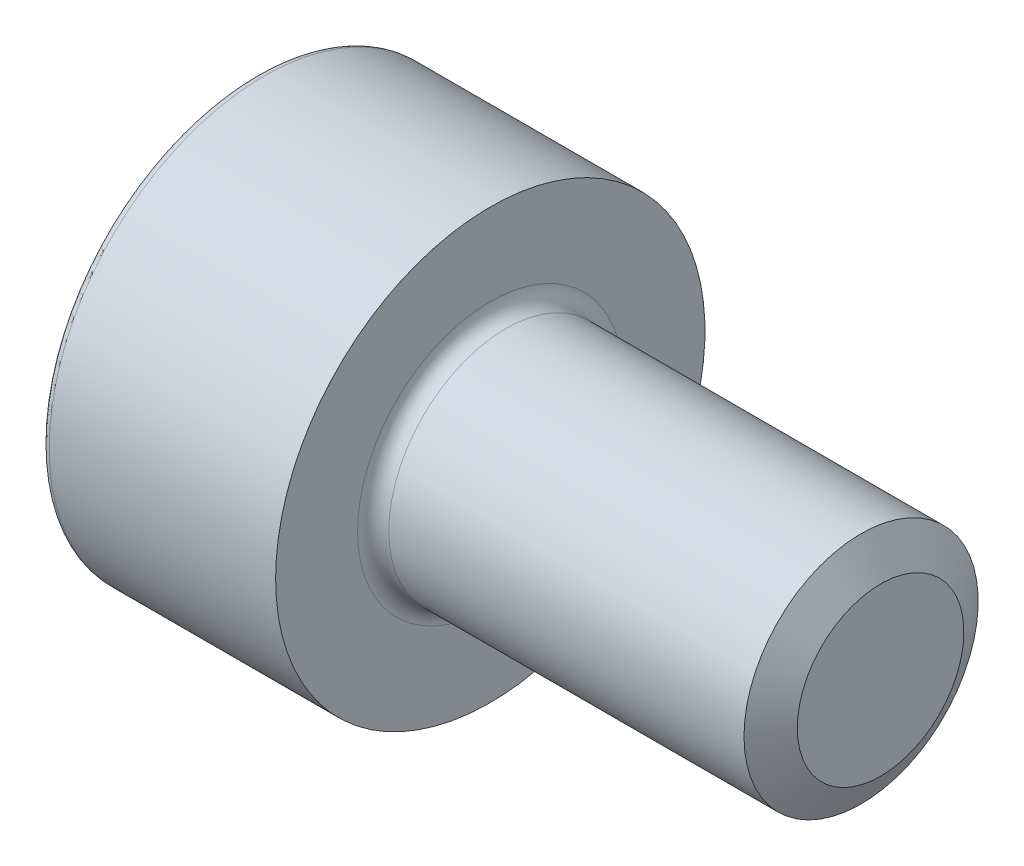
ISO-10303-21;
HEADER;
FILE_DESCRIPTION(('STEP AP214'),'2;1');
FILE_NAME('part.step','',(''),(''),'','','');
FILE_SCHEMA(('AUTOMOTIVE_DESIGN { 1 0 10303 214 1 1 1 1 }'));
ENDSEC;
DATA;
#1=APPLICATION_CONTEXT('core data for automotive mechanical design processes');
#2=APPLICATION_PROTOCOL_DEFINITION('international standard','automotive_design',2000,#1);
#3=PRODUCT_CONTEXT('',#1,'mechanical');
#4=PRODUCT('Part','Part','',(#3));
#5=PRODUCT_RELATED_PRODUCT_CATEGORY('part','',(#4));
#6=PRODUCT_DEFINITION_FORMATION('','',#4);
#7=PRODUCT_DEFINITION_CONTEXT('part definition',#1,'design');
#8=PRODUCT_DEFINITION('design','',#6,#7);
#9=PRODUCT_DEFINITION_SHAPE('','',#8);
#10=(LENGTH_UNIT() NAMED_UNIT(*) SI_UNIT(.MILLI.,.METRE.));
#11=(NAMED_UNIT(*) PLANE_ANGLE_UNIT() SI_UNIT($,.RADIAN.));
#12=(NAMED_UNIT(*) SI_UNIT($,.STERADIAN.) SOLID_ANGLE_UNIT());
#13=UNCERTAINTY_MEASURE_WITH_UNIT(LENGTH_MEASURE(1.E-05),#10,'distance_accuracy_value','');
#14=(GEOMETRIC_REPRESENTATION_CONTEXT(3) GLOBAL_UNCERTAINTY_ASSIGNED_CONTEXT((#13)) GLOBAL_UNIT_ASSIGNED_CONTEXT((#10,
#11,#12)) REPRESENTATION_CONTEXT('',''));
#15=CARTESIAN_POINT('',(0.,0.,0.));
#16=DIRECTION('',(0.,0.,1.));
#17=DIRECTION('',(1.,0.,0.));
#18=AXIS2_PLACEMENT_3D('',#15,#16,#17);
#19=CARTESIAN_POINT('',(0.,0.,0.));
#20=DIRECTION('',(-1.,0.,0.));
#21=DIRECTION('',(0.,0.,1.));
#22=AXIS2_PLACEMENT_3D('',#19,#20,#21);
#23=CYLINDRICAL_SURFACE('',#22,1.5);
#24=CARTESIAN_POINT('',(3.2,0.,0.));
#25=DIRECTION('',(-1.,0.,0.));
#26=DIRECTION('',(0.,0.,1.));
#27=AXIS2_PLACEMENT_3D('',#24,#25,#26);
#28=CIRCLE('',#27,1.5);
#29=CARTESIAN_POINT('',(3.2,0.,1.5));
#30=VERTEX_POINT('',#29);
#31=EDGE_CURVE('E143',#30,#30,#28,.T.);
#32=ORIENTED_EDGE('',*,*,#31,.F.);
#33=EDGE_LOOP('',(#32));
#34=FACE_BOUND('',#33,.T.);
#35=CARTESIAN_POINT('',(7.75000733344089,0.,0.));
#36=DIRECTION('',(-1.,0.,0.));
#37=DIRECTION('',(0.,0.,1.));
#38=AXIS2_PLACEMENT_3D('',#35,#36,#37);
#39=CIRCLE('',#38,1.5);
#40=CARTESIAN_POINT('',(7.75000733344089,0.,1.5));
#41=VERTEX_POINT('',#40);
#42=EDGE_CURVE('E280',#41,#41,#39,.T.);
#43=ORIENTED_EDGE('',*,*,#42,.T.);
#44=EDGE_LOOP('',(#43));
#45=FACE_BOUND('',#44,.T.);
#46=ADVANCED_FACE('F40',(#34,#45),#23,.T.);
#47=CARTESIAN_POINT('',(0.,0.,0.));
#48=DIRECTION('',(1.,0.,0.));
#49=DIRECTION('',(0.,0.,-1.));
#50=AXIS2_PLACEMENT_3D('',#47,#48,#49);
#51=PLANE('',#50);
#52=CARTESIAN_POINT('',(0.,0.,0.));
#53=DIRECTION('',(1.,0.,0.));
#54=DIRECTION('',(0.,0.,-1.));
#55=AXIS2_PLACEMENT_3D('',#52,#53,#54);
#56=CIRCLE('',#55,2.65);
#57=CARTESIAN_POINT('',(0.,0.,-2.65));
#58=VERTEX_POINT('',#57);
#59=EDGE_CURVE('E48',#58,#58,#56,.F.);
#60=ORIENTED_EDGE('',*,*,#59,.T.);
#61=EDGE_LOOP('',(#60));
#62=FACE_BOUND('',#61,.T.);
#63=DIRECTION('',(0.,0.866025403784439,-0.5));
#64=VECTOR('',#63,1.);
#65=CARTESIAN_POINT('',(0.,0.,1.435));
#66=LINE('',#65,#64);
#67=CARTESIAN_POINT('',(0.,0.,1.435));
#68=VERTEX_POINT('',#67);
#69=CARTESIAN_POINT('',(0.,1.24274645443067,0.717499999999999));
#70=VERTEX_POINT('',#69);
#71=EDGE_CURVE('E129',#68,#70,#66,.T.);
#72=ORIENTED_EDGE('',*,*,#71,.F.);
#73=DIRECTION('',(0.,0.866025403784439,0.5));
#74=VECTOR('',#73,1.);
#75=CARTESIAN_POINT('',(0.,-1.24274645443067,0.7175));
#76=LINE('',#75,#74);
#77=CARTESIAN_POINT('',(0.,-1.24274645443067,0.7175));
#78=VERTEX_POINT('',#77);
#79=EDGE_CURVE('E55',#78,#68,#76,.T.);
#80=ORIENTED_EDGE('',*,*,#79,.F.);
#81=DIRECTION('',(0.,0.,1.));
#82=VECTOR('',#81,1.);
#83=CARTESIAN_POINT('',(0.,-1.24274645443067,-0.7175));
#84=LINE('',#83,#82);
#85=CARTESIAN_POINT('',(0.,-1.24274645443067,-0.7175));
#86=VERTEX_POINT('',#85);
#87=EDGE_CURVE('E139',#86,#78,#84,.T.);
#88=ORIENTED_EDGE('',*,*,#87,.F.);
#89=DIRECTION('',(0.,-0.866025403784439,0.5));
#90=VECTOR('',#89,1.);
#91=CARTESIAN_POINT('',(0.,0.,-1.435));
#92=LINE('',#91,#90);
#93=CARTESIAN_POINT('',(0.,0.,-1.435));
#94=VERTEX_POINT('',#93);
#95=EDGE_CURVE('E137',#94,#86,#92,.T.);
#96=ORIENTED_EDGE('',*,*,#95,.F.);
#97=DIRECTION('',(0.,-0.866025403784439,-0.5));
#98=VECTOR('',#97,1.);
#99=CARTESIAN_POINT('',(0.,1.24274645443067,-0.7175));
#100=LINE('',#99,#98);
#101=CARTESIAN_POINT('',(0.,1.24274645443067,-0.7175));
#102=VERTEX_POINT('',#101);
#103=EDGE_CURVE('E103',#102,#94,#100,.T.);
#104=ORIENTED_EDGE('',*,*,#103,.F.);
#105=DIRECTION('',(0.,0.,-1.));
#106=VECTOR('',#105,1.);
#107=CARTESIAN_POINT('',(0.,1.24274645443067,0.717499999999999));
#108=LINE('',#107,#106);
#109=EDGE_CURVE('E133',#70,#102,#108,.T.);
#110=ORIENTED_EDGE('',*,*,#109,.F.);
#111=EDGE_LOOP('',(#72,#80,#88,#96,#104,#110));
#112=FACE_BOUND('',#111,.T.);
#113=ADVANCED_FACE('F160',(#62,#112),#51,.F.);
#114=CARTESIAN_POINT('',(0.,0.,0.));
#115=DIRECTION('',(-1.,0.,0.));
#116=DIRECTION('',(0.,0.,1.));
#117=AXIS2_PLACEMENT_3D('',#114,#115,#116);
#118=CYLINDRICAL_SURFACE('',#117,2.75);
#119=CARTESIAN_POINT('',(0.1,0.,0.));
#120=DIRECTION('',(1.,0.,0.));
#121=DIRECTION('',(0.,0.,-1.));
#122=AXIS2_PLACEMENT_3D('',#119,#120,#121);
#123=CIRCLE('',#122,2.75);
#124=CARTESIAN_POINT('',(0.1,0.,-2.75));
#125=VERTEX_POINT('',#124);
#126=EDGE_CURVE('E11',#125,#125,#123,.T.);
#127=ORIENTED_EDGE('',*,*,#126,.T.);
#128=EDGE_LOOP('',(#127));
#129=FACE_BOUND('',#128,.T.);
#130=CARTESIAN_POINT('',(3.,0.,0.));
#131=DIRECTION('',(-1.,0.,0.));
#132=DIRECTION('',(0.,0.,1.));
#133=AXIS2_PLACEMENT_3D('',#130,#131,#132);
#134=CIRCLE('',#133,2.75);
#135=CARTESIAN_POINT('',(3.,0.,2.75));
#136=VERTEX_POINT('',#135);
#137=EDGE_CURVE('E154',#136,#136,#134,.T.);
#138=ORIENTED_EDGE('',*,*,#137,.T.);
#139=EDGE_LOOP('',(#138));
#140=FACE_BOUND('',#139,.T.);
#141=ADVANCED_FACE('F179',(#129,#140),#118,.T.);
#142=CARTESIAN_POINT('',(3.,2.75,0.));
#143=DIRECTION('',(-1.,0.,0.));
#144=DIRECTION('',(0.,0.,1.));
#145=AXIS2_PLACEMENT_3D('',#142,#143,#144);
#146=PLANE('',#145);
#147=ORIENTED_EDGE('',*,*,#137,.F.);
#148=EDGE_LOOP('',(#147));
#149=FACE_BOUND('',#148,.T.);
#150=CARTESIAN_POINT('',(3.,0.,0.));
#151=DIRECTION('',(-1.,0.,0.));
#152=DIRECTION('',(0.,0.,1.));
#153=AXIS2_PLACEMENT_3D('',#150,#151,#152);
#154=CIRCLE('',#153,1.7);
#155=CARTESIAN_POINT('',(3.,0.,1.7));
#156=VERTEX_POINT('',#155);
#157=EDGE_CURVE('E151',#156,#156,#154,.T.);
#158=ORIENTED_EDGE('',*,*,#157,.T.);
#159=EDGE_LOOP('',(#158));
#160=FACE_BOUND('',#159,.T.);
#161=ADVANCED_FACE('F188',(#149,#160),#146,.F.);
#162=CARTESIAN_POINT('',(3.2,0.,0.));
#163=DIRECTION('',(-1.,0.,0.));
#164=DIRECTION('',(0.,0.,1.));
#165=AXIS2_PLACEMENT_3D('',#162,#163,#164);
#166=TOROIDAL_SURFACE('',#165,1.7,0.2);
#167=ORIENTED_EDGE('',*,*,#157,.F.);
#168=EDGE_LOOP('',(#167));
#169=FACE_BOUND('',#168,.T.);
#170=ORIENTED_EDGE('',*,*,#31,.T.);
#171=EDGE_LOOP('',(#170));
#172=FACE_BOUND('',#171,.T.);
#173=ADVANCED_FACE('F184',(#169,#172),#166,.F.);
#174=CARTESIAN_POINT('',(1.3,-1.24274645443067,0.7175));
#175=DIRECTION('',(0.,-0.5,0.866025403784439));
#176=DIRECTION('',(0.,-0.866025403784439,-0.5));
#177=AXIS2_PLACEMENT_3D('',#174,#175,#176);
#178=PLANE('',#177);
#179=ORIENTED_EDGE('',*,*,#79,.T.);
#180=DIRECTION('',(-1.,0.,0.));
#181=VECTOR('',#180,1.);
#182=CARTESIAN_POINT('',(1.3,0.,1.435));
#183=LINE('',#182,#181);
#184=CARTESIAN_POINT('',(1.3,0.,1.435));
#185=VERTEX_POINT('',#184);
#186=EDGE_CURVE('E85',#185,#68,#183,.T.);
#187=ORIENTED_EDGE('',*,*,#186,.F.);
#188=DIRECTION('',(0.,0.866025403784439,0.5));
#189=VECTOR('',#188,1.);
#190=CARTESIAN_POINT('',(1.3,-1.24274645443067,0.7175));
#191=LINE('',#190,#189);
#192=CARTESIAN_POINT('',(1.3,-1.24274645443067,0.7175));
#193=VERTEX_POINT('',#192);
#194=EDGE_CURVE('E141',#193,#185,#191,.T.);
#195=ORIENTED_EDGE('',*,*,#194,.F.);
#196=DIRECTION('',(-1.,0.,0.));
#197=VECTOR('',#196,1.);
#198=CARTESIAN_POINT('',(1.3,-1.24274645443067,0.7175));
#199=LINE('',#198,#197);
#200=EDGE_CURVE('E63',#193,#78,#199,.T.);
#201=ORIENTED_EDGE('',*,*,#200,.T.);
#202=EDGE_LOOP('',(#179,#187,#195,#201));
#203=FACE_BOUND('',#202,.T.);
#204=ADVANCED_FACE('F187',(#203),#178,.F.);
#205=CARTESIAN_POINT('',(1.3,-1.24274645443067,-0.7175));
#206=DIRECTION('',(0.,-1.,0.));
#207=DIRECTION('',(0.,0.,-1.));
#208=AXIS2_PLACEMENT_3D('',#205,#206,#207);
#209=PLANE('',#208);
#210=ORIENTED_EDGE('',*,*,#87,.T.);
#211=ORIENTED_EDGE('',*,*,#200,.F.);
#212=DIRECTION('',(0.,0.,1.));
#213=VECTOR('',#212,1.);
#214=CARTESIAN_POINT('',(1.3,-1.24274645443067,-0.7175));
#215=LINE('',#214,#213);
#216=CARTESIAN_POINT('',(1.3,-1.24274645443067,-0.7175));
#217=VERTEX_POINT('',#216);
#218=EDGE_CURVE('E115',#217,#193,#215,.T.);
#219=ORIENTED_EDGE('',*,*,#218,.F.);
#220=DIRECTION('',(-1.,0.,0.));
#221=VECTOR('',#220,1.);
#222=CARTESIAN_POINT('',(1.3,-1.24274645443067,-0.7175));
#223=LINE('',#222,#221);
#224=EDGE_CURVE('E107',#217,#86,#223,.T.);
#225=ORIENTED_EDGE('',*,*,#224,.T.);
#226=EDGE_LOOP('',(#210,#211,#219,#225));
#227=FACE_BOUND('',#226,.T.);
#228=ADVANCED_FACE('F218',(#227),#209,.F.);
#229=CARTESIAN_POINT('',(1.3,0.,-1.435));
#230=DIRECTION('',(0.,-0.5,-0.866025403784439));
#231=DIRECTION('',(0.,0.866025403784439,-0.5));
#232=AXIS2_PLACEMENT_3D('',#229,#230,#231);
#233=PLANE('',#232);
#234=ORIENTED_EDGE('',*,*,#95,.T.);
#235=ORIENTED_EDGE('',*,*,#224,.F.);
#236=DIRECTION('',(0.,-0.866025403784439,0.5));
#237=VECTOR('',#236,1.);
#238=CARTESIAN_POINT('',(1.3,0.,-1.435));
#239=LINE('',#238,#237);
#240=CARTESIAN_POINT('',(1.3,0.,-1.435));
#241=VERTEX_POINT('',#240);
#242=EDGE_CURVE('E111',#241,#217,#239,.T.);
#243=ORIENTED_EDGE('',*,*,#242,.F.);
#244=DIRECTION('',(-1.,0.,0.));
#245=VECTOR('',#244,1.);
#246=CARTESIAN_POINT('',(1.3,0.,-1.435));
#247=LINE('',#246,#245);
#248=EDGE_CURVE('E96',#241,#94,#247,.T.);
#249=ORIENTED_EDGE('',*,*,#248,.T.);
#250=EDGE_LOOP('',(#234,#235,#243,#249));
#251=FACE_BOUND('',#250,.T.);
#252=ADVANCED_FACE('F112',(#251),#233,.F.);
#253=CARTESIAN_POINT('',(1.3,1.24274645443067,-0.7175));
#254=DIRECTION('',(0.,0.5,-0.866025403784439));
#255=DIRECTION('',(0.,0.866025403784439,0.5));
#256=AXIS2_PLACEMENT_3D('',#253,#254,#255);
#257=PLANE('',#256);
#258=ORIENTED_EDGE('',*,*,#103,.T.);
#259=ORIENTED_EDGE('',*,*,#248,.F.);
#260=DIRECTION('',(0.,-0.866025403784439,-0.5));
#261=VECTOR('',#260,1.);
#262=CARTESIAN_POINT('',(1.3,1.24274645443067,-0.7175));
#263=LINE('',#262,#261);
#264=CARTESIAN_POINT('',(1.3,1.24274645443067,-0.7175));
#265=VERTEX_POINT('',#264);
#266=EDGE_CURVE('E100',#265,#241,#263,.T.);
#267=ORIENTED_EDGE('',*,*,#266,.F.);
#268=DIRECTION('',(-1.,0.,0.));
#269=VECTOR('',#268,1.);
#270=CARTESIAN_POINT('',(1.3,1.24274645443067,-0.7175));
#271=LINE('',#270,#269);
#272=EDGE_CURVE('E108',#265,#102,#271,.T.);
#273=ORIENTED_EDGE('',*,*,#272,.T.);
#274=EDGE_LOOP('',(#258,#259,#267,#273));
#275=FACE_BOUND('',#274,.T.);
#276=ADVANCED_FACE('F98',(#275),#257,.F.);
#277=CARTESIAN_POINT('',(1.3,1.24274645443067,0.717499999999999));
#278=DIRECTION('',(0.,1.,0.));
#279=DIRECTION('',(0.,0.,1.));
#280=AXIS2_PLACEMENT_3D('',#277,#278,#279);
#281=PLANE('',#280);
#282=ORIENTED_EDGE('',*,*,#109,.T.);
#283=ORIENTED_EDGE('',*,*,#272,.F.);
#284=DIRECTION('',(0.,0.,-1.));
#285=VECTOR('',#284,1.);
#286=CARTESIAN_POINT('',(1.3,1.24274645443067,0.717499999999999));
#287=LINE('',#286,#285);
#288=CARTESIAN_POINT('',(1.3,1.24274645443067,0.717499999999999));
#289=VERTEX_POINT('',#288);
#290=EDGE_CURVE('E121',#289,#265,#287,.T.);
#291=ORIENTED_EDGE('',*,*,#290,.F.);
#292=DIRECTION('',(-1.,0.,0.));
#293=VECTOR('',#292,1.);
#294=CARTESIAN_POINT('',(1.3,1.24274645443067,0.717499999999999));
#295=LINE('',#294,#293);
#296=EDGE_CURVE('E146',#289,#70,#295,.T.);
#297=ORIENTED_EDGE('',*,*,#296,.T.);
#298=EDGE_LOOP('',(#282,#283,#291,#297));
#299=FACE_BOUND('',#298,.T.);
#300=ADVANCED_FACE('F236',(#299),#281,.F.);
#301=CARTESIAN_POINT('',(1.3,0.,1.435));
#302=DIRECTION('',(0.,0.5,0.866025403784439));
#303=DIRECTION('',(0.,-0.866025403784439,0.5));
#304=AXIS2_PLACEMENT_3D('',#301,#302,#303);
#305=PLANE('',#304);
#306=ORIENTED_EDGE('',*,*,#71,.T.);
#307=ORIENTED_EDGE('',*,*,#296,.F.);
#308=DIRECTION('',(0.,0.866025403784439,-0.5));
#309=VECTOR('',#308,1.);
#310=CARTESIAN_POINT('',(1.3,0.,1.435));
#311=LINE('',#310,#309);
#312=EDGE_CURVE('E123',#185,#289,#311,.T.);
#313=ORIENTED_EDGE('',*,*,#312,.F.);
#314=ORIENTED_EDGE('',*,*,#186,.T.);
#315=EDGE_LOOP('',(#306,#307,#313,#314));
#316=FACE_BOUND('',#315,.T.);
#317=ADVANCED_FACE('F243',(#316),#305,.F.);
#318=CARTESIAN_POINT('',(1.3,-1.24274645443067,0.7175));
#319=DIRECTION('',(1.,0.,0.));
#320=DIRECTION('',(0.,0.,-1.));
#321=AXIS2_PLACEMENT_3D('',#318,#319,#320);
#322=PLANE('',#321);
#323=ORIENTED_EDGE('',*,*,#194,.T.);
#324=ORIENTED_EDGE('',*,*,#312,.T.);
#325=ORIENTED_EDGE('',*,*,#290,.T.);
#326=ORIENTED_EDGE('',*,*,#266,.T.);
#327=ORIENTED_EDGE('',*,*,#242,.T.);
#328=ORIENTED_EDGE('',*,*,#218,.T.);
#329=EDGE_LOOP('',(#323,#324,#325,#326,#327,#328));
#330=FACE_BOUND('',#329,.T.);
#331=ADVANCED_FACE('F118',(#330),#322,.F.);
#332=CARTESIAN_POINT('',(7.75000733344089,0.,0.));
#333=DIRECTION('',(-1.,0.,0.));
#334=DIRECTION('',(0.,0.,1.));
#335=AXIS2_PLACEMENT_3D('',#332,#333,#334);
#336=CONICAL_SURFACE('',#335,1.5,1.04719755119659);
#337=CARTESIAN_POINT('',(8.,0.,0.));
#338=DIRECTION('',(-1.,0.,0.));
#339=DIRECTION('',(0.,0.,1.));
#340=AXIS2_PLACEMENT_3D('',#337,#338,#339);
#341=CIRCLE('',#340,1.067);
#342=CARTESIAN_POINT('',(8.,0.,1.067));
#343=VERTEX_POINT('',#342);
#344=EDGE_CURVE('E130',#343,#343,#341,.T.);
#345=ORIENTED_EDGE('',*,*,#344,.T.);
#346=EDGE_LOOP('',(#345));
#347=FACE_BOUND('',#346,.T.);
#348=ORIENTED_EDGE('',*,*,#42,.F.);
#349=EDGE_LOOP('',(#348));
#350=FACE_BOUND('',#349,.T.);
#351=ADVANCED_FACE('F169',(#347,#350),#336,.T.);
#352=CARTESIAN_POINT('',(8.,1.5,0.));
#353=DIRECTION('',(-1.,0.,0.));
#354=DIRECTION('',(0.,0.,1.));
#355=AXIS2_PLACEMENT_3D('',#352,#353,#354);
#356=PLANE('',#355);
#357=ORIENTED_EDGE('',*,*,#344,.F.);
#358=EDGE_LOOP('',(#357));
#359=FACE_BOUND('',#358,.T.);
#360=ADVANCED_FACE('F164',(#359),#356,.F.);
#361=CARTESIAN_POINT('',(0.1,0.,0.));
#362=DIRECTION('',(1.,0.,0.));
#363=DIRECTION('',(0.,0.,-1.));
#364=AXIS2_PLACEMENT_3D('',#361,#362,#363);
#365=TOROIDAL_SURFACE('',#364,2.65,0.1);
#366=ORIENTED_EDGE('',*,*,#126,.F.);
#367=EDGE_LOOP('',(#366));
#368=FACE_BOUND('',#367,.T.);
#369=ORIENTED_EDGE('',*,*,#59,.F.);
#370=EDGE_LOOP('',(#369));
#371=FACE_BOUND('',#370,.T.);
#372=ADVANCED_FACE('F42',(#368,#371),#365,.T.);
#373=CLOSED_SHELL('',(#46,#113,#141,#161,#173,#204,#228,#252,#276,#300,#317,#331,#351,#360,#372));
#374=MANIFOLD_SOLID_BREP('B2',#373);
#375=ADVANCED_BREP_SHAPE_REPRESENTATION('',(#18,#374),#14);
#376=SHAPE_DEFINITION_REPRESENTATION(#9,#375);
ENDSEC;
END-ISO-10303-21;
